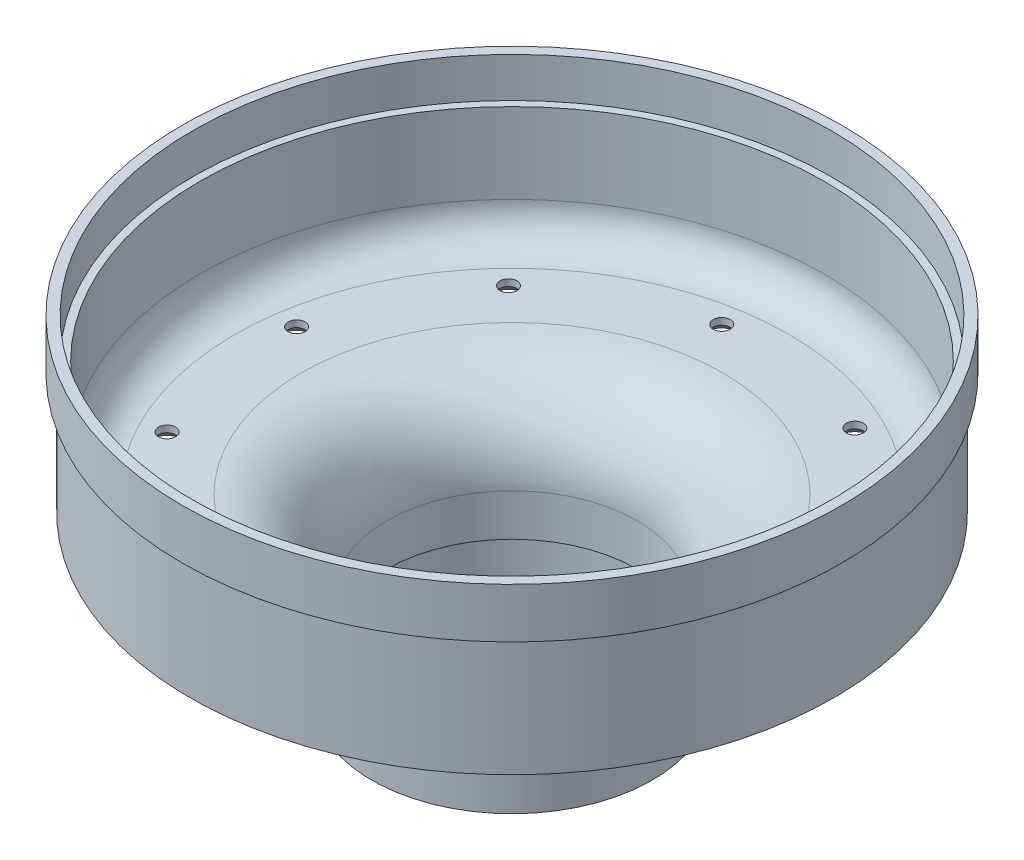
ISO-10303-21;
HEADER;
FILE_DESCRIPTION(('STEP AP214'),'2;1');
FILE_NAME('part.step','',(''),(''),'','','');
FILE_SCHEMA(('AUTOMOTIVE_DESIGN { 1 0 10303 214 1 1 1 1 }'));
ENDSEC;
DATA;
#1=APPLICATION_CONTEXT('core data for automotive mechanical design processes');
#2=APPLICATION_PROTOCOL_DEFINITION('international standard','automotive_design',2000,#1);
#3=PRODUCT_CONTEXT('',#1,'mechanical');
#4=PRODUCT('Part','Part','',(#3));
#5=PRODUCT_RELATED_PRODUCT_CATEGORY('part','',(#4));
#6=PRODUCT_DEFINITION_FORMATION('','',#4);
#7=PRODUCT_DEFINITION_CONTEXT('part definition',#1,'design');
#8=PRODUCT_DEFINITION('design','',#6,#7);
#9=PRODUCT_DEFINITION_SHAPE('','',#8);
#10=(LENGTH_UNIT() NAMED_UNIT(*) SI_UNIT(.MILLI.,.METRE.));
#11=(NAMED_UNIT(*) PLANE_ANGLE_UNIT() SI_UNIT($,.RADIAN.));
#12=(NAMED_UNIT(*) SI_UNIT($,.STERADIAN.) SOLID_ANGLE_UNIT());
#13=UNCERTAINTY_MEASURE_WITH_UNIT(LENGTH_MEASURE(1.E-05),#10,'distance_accuracy_value','');
#14=(GEOMETRIC_REPRESENTATION_CONTEXT(3) GLOBAL_UNCERTAINTY_ASSIGNED_CONTEXT((#13)) GLOBAL_UNIT_ASSIGNED_CONTEXT((#10,
#11,#12)) REPRESENTATION_CONTEXT('',''));
#15=CARTESIAN_POINT('',(0.,0.,0.));
#16=DIRECTION('',(0.,0.,1.));
#17=DIRECTION('',(1.,0.,0.));
#18=AXIS2_PLACEMENT_3D('',#15,#16,#17);
#19=CARTESIAN_POINT('',(-39.98,33.0457479199709,0.));
#20=DIRECTION('',(0.,1.,0.));
#21=DIRECTION('',(0.,0.,1.));
#22=AXIS2_PLACEMENT_3D('',#19,#20,#21);
#23=PLANE('',#22);
#24=CARTESIAN_POINT('',(-22.8065107885822,33.0457479199709,45.8515328604212));
#25=DIRECTION('',(0.,-1.,0.));
#26=DIRECTION('',(0.,0.,-1.));
#27=AXIS2_PLACEMENT_3D('',#24,#25,#26);
#28=CIRCLE('',#27,3.36);
#29=CARTESIAN_POINT('',(-22.8065107885822,33.0457479199709,42.4915328604212));
#30=VERTEX_POINT('',#29);
#31=EDGE_CURVE('E553',#30,#30,#28,.T.);
#32=ORIENTED_EDGE('',*,*,#31,.F.);
#33=EDGE_LOOP('',(#32));
#34=FACE_BOUND('',#33,.T.);
#35=CARTESIAN_POINT('',(-45.4017096207179,33.0457479199709,23.6893386044442));
#36=DIRECTION('',(0.,-1.,0.));
#37=DIRECTION('',(0.,0.,-1.));
#38=AXIS2_PLACEMENT_3D('',#35,#36,#37);
#39=CIRCLE('',#38,3.36);
#40=CARTESIAN_POINT('',(-45.4017096207179,33.0457479199709,20.3293386044442));
#41=VERTEX_POINT('',#40);
#42=EDGE_CURVE('E96',#41,#41,#39,.T.);
#43=ORIENTED_EDGE('',*,*,#42,.F.);
#44=EDGE_LOOP('',(#43));
#45=FACE_BOUND('',#44,.T.);
#46=CARTESIAN_POINT('',(-36.5597996929573,33.0457479199709,-35.8591835714485));
#47=DIRECTION('',(0.,-1.,0.));
#48=DIRECTION('',(0.,0.,-1.));
#49=AXIS2_PLACEMENT_3D('',#46,#47,#48);
#50=CIRCLE('',#49,3.36);
#51=CARTESIAN_POINT('',(-36.5597996929573,33.0457479199709,-39.2191835714485));
#52=VERTEX_POINT('',#51);
#53=EDGE_CURVE('E85',#52,#52,#50,.T.);
#54=ORIENTED_EDGE('',*,*,#53,.F.);
#55=EDGE_LOOP('',(#54));
#56=FACE_BOUND('',#55,.T.);
#57=CARTESIAN_POINT('',(-8.5,33.0457479199709,-50.5));
#58=DIRECTION('',(0.,-1.,0.));
#59=DIRECTION('',(0.,0.,-1.));
#60=AXIS2_PLACEMENT_3D('',#57,#58,#59);
#61=CIRCLE('',#60,3.36);
#62=CARTESIAN_POINT('',(-8.5,33.0457479199709,-53.86));
#63=VERTEX_POINT('',#62);
#64=EDGE_CURVE('E81',#63,#63,#61,.T.);
#65=ORIENTED_EDGE('',*,*,#64,.F.);
#66=EDGE_LOOP('',(#65));
#67=FACE_BOUND('',#66,.T.);
#68=CARTESIAN_POINT('',(22.8065107885826,33.0457479199709,-45.851532860421));
#69=DIRECTION('',(0.,-1.,0.));
#70=DIRECTION('',(0.,0.,-1.));
#71=AXIS2_PLACEMENT_3D('',#68,#69,#70);
#72=CIRCLE('',#71,3.36);
#73=CARTESIAN_POINT('',(22.8065107885826,33.0457479199709,-49.211532860421));
#74=VERTEX_POINT('',#73);
#75=EDGE_CURVE('E76',#74,#74,#72,.T.);
#76=ORIENTED_EDGE('',*,*,#75,.F.);
#77=EDGE_LOOP('',(#76));
#78=FACE_BOUND('',#77,.T.);
#79=CARTESIAN_POINT('',(45.4017096207181,33.0457479199709,-23.6893386044439));
#80=DIRECTION('',(0.,-1.,0.));
#81=DIRECTION('',(0.,0.,-1.));
#82=AXIS2_PLACEMENT_3D('',#79,#80,#81);
#83=CIRCLE('',#82,3.36);
#84=CARTESIAN_POINT('',(45.4017096207181,33.0457479199709,-27.0493386044439));
#85=VERTEX_POINT('',#84);
#86=EDGE_CURVE('E71',#85,#85,#83,.T.);
#87=ORIENTED_EDGE('',*,*,#86,.F.);
#88=EDGE_LOOP('',(#87));
#89=FACE_BOUND('',#88,.T.);
#90=CARTESIAN_POINT('',(50.6549985250923,33.0457479199709,7.5213778274259));
#91=DIRECTION('',(0.,-1.,0.));
#92=DIRECTION('',(0.,0.,-1.));
#93=AXIS2_PLACEMENT_3D('',#90,#91,#92);
#94=CIRCLE('',#93,3.36);
#95=CARTESIAN_POINT('',(50.6549985250923,33.0457479199709,4.1613778274259));
#96=VERTEX_POINT('',#95);
#97=EDGE_CURVE('E66',#96,#96,#94,.T.);
#98=ORIENTED_EDGE('',*,*,#97,.F.);
#99=EDGE_LOOP('',(#98));
#100=FACE_BOUND('',#99,.T.);
#101=CARTESIAN_POINT('',(36.559799692957,33.0457479199709,35.8591835714488));
#102=DIRECTION('',(0.,-1.,0.));
#103=DIRECTION('',(0.,0.,-1.));
#104=AXIS2_PLACEMENT_3D('',#101,#102,#103);
#105=CIRCLE('',#104,3.36);
#106=CARTESIAN_POINT('',(36.559799692957,33.0457479199709,32.4991835714488));
#107=VERTEX_POINT('',#106);
#108=EDGE_CURVE('E61',#107,#107,#105,.T.);
#109=ORIENTED_EDGE('',*,*,#108,.F.);
#110=EDGE_LOOP('',(#109));
#111=FACE_BOUND('',#110,.T.);
#112=CARTESIAN_POINT('',(8.5,33.0457479199709,50.5));
#113=DIRECTION('',(0.,-1.,0.));
#114=DIRECTION('',(0.,0.,-1.));
#115=AXIS2_PLACEMENT_3D('',#112,#113,#114);
#116=CIRCLE('',#115,3.36);
#117=CARTESIAN_POINT('',(8.5,33.0457479199709,47.14));
#118=VERTEX_POINT('',#117);
#119=EDGE_CURVE('E56',#118,#118,#116,.T.);
#120=ORIENTED_EDGE('',*,*,#119,.F.);
#121=EDGE_LOOP('',(#120));
#122=FACE_BOUND('',#121,.T.);
#123=CARTESIAN_POINT('',(0.,33.0457479199709,0.));
#124=DIRECTION('',(0.,-1.,0.));
#125=DIRECTION('',(0.,0.,-1.));
#126=AXIS2_PLACEMENT_3D('',#123,#124,#125);
#127=CIRCLE('',#126,39.98);
#128=CARTESIAN_POINT('',(0.,33.0457479199709,-39.98));
#129=VERTEX_POINT('',#128);
#130=EDGE_CURVE('E139',#129,#129,#127,.T.);
#131=ORIENTED_EDGE('',*,*,#130,.F.);
#132=EDGE_LOOP('',(#131));
#133=FACE_BOUND('',#132,.T.);
#134=CARTESIAN_POINT('',(0.,33.0457479199709,0.));
#135=DIRECTION('',(0.,-1.,0.));
#136=DIRECTION('',(0.,0.,-1.));
#137=AXIS2_PLACEMENT_3D('',#134,#135,#136);
#138=CIRCLE('',#137,64.5);
#139=CARTESIAN_POINT('',(0.,33.0457479199709,-64.5));
#140=VERTEX_POINT('',#139);
#141=EDGE_CURVE('E142',#140,#140,#138,.T.);
#142=ORIENTED_EDGE('',*,*,#141,.T.);
#143=EDGE_LOOP('',(#142));
#144=FACE_BOUND('',#143,.T.);
#145=CARTESIAN_POINT('',(-50.6549985250924,33.0457479199709,-7.52137782742555));
#146=DIRECTION('',(0.,-1.,0.));
#147=DIRECTION('',(0.,0.,-1.));
#148=AXIS2_PLACEMENT_3D('',#145,#146,#147);
#149=CIRCLE('',#148,3.36);
#150=CARTESIAN_POINT('',(-50.6549985250924,33.0457479199709,-10.8813778274256));
#151=VERTEX_POINT('',#150);
#152=EDGE_CURVE('E89',#151,#151,#149,.T.);
#153=ORIENTED_EDGE('',*,*,#152,.F.);
#154=EDGE_LOOP('',(#153));
#155=FACE_BOUND('',#154,.T.);
#156=ADVANCED_FACE('F31',(#34,#45,#56,#67,#78,#89,#100,#111,#122,#133,#144,#155),#23,.F.);
#157=CARTESIAN_POINT('',(-26.6,0.545747919970938,0.));
#158=DIRECTION('',(0.,1.,0.));
#159=DIRECTION('',(0.,0.,1.));
#160=AXIS2_PLACEMENT_3D('',#157,#158,#159);
#161=PLANE('',#160);
#162=CARTESIAN_POINT('',(0.,0.545747919970939,0.));
#163=DIRECTION('',(0.,-1.,0.));
#164=DIRECTION('',(0.,0.,-1.));
#165=AXIS2_PLACEMENT_3D('',#162,#163,#164);
#166=CIRCLE('',#165,26.6);
#167=CARTESIAN_POINT('',(0.,0.545747919970939,-26.6));
#168=VERTEX_POINT('',#167);
#169=EDGE_CURVE('E10',#168,#168,#166,.T.);
#170=ORIENTED_EDGE('',*,*,#169,.F.);
#171=EDGE_LOOP('',(#170));
#172=FACE_BOUND('',#171,.T.);
#173=CARTESIAN_POINT('',(0.,0.545747919970938,0.));
#174=DIRECTION('',(0.,-1.,0.));
#175=DIRECTION('',(0.,0.,-1.));
#176=AXIS2_PLACEMENT_3D('',#173,#174,#175);
#177=CIRCLE('',#176,28.1);
#178=CARTESIAN_POINT('',(0.,0.545747919970938,-28.1));
#179=VERTEX_POINT('',#178);
#180=EDGE_CURVE('E51',#179,#179,#177,.T.);
#181=ORIENTED_EDGE('',*,*,#180,.T.);
#182=EDGE_LOOP('',(#181));
#183=FACE_BOUND('',#182,.T.);
#184=ADVANCED_FACE('F33',(#172,#183),#161,.F.);
#185=CARTESIAN_POINT('',(0.,0.,0.));
#186=DIRECTION('',(0.,-1.,0.));
#187=DIRECTION('',(0.,0.,-1.));
#188=AXIS2_PLACEMENT_3D('',#185,#186,#187);
#189=CYLINDRICAL_SURFACE('',#188,26.6);
#190=CARTESIAN_POINT('',(0.,10.5457479199709,0.));
#191=DIRECTION('',(0.,-1.,0.));
#192=DIRECTION('',(0.,0.,-1.));
#193=AXIS2_PLACEMENT_3D('',#190,#191,#192);
#194=CIRCLE('',#193,26.6);
#195=CARTESIAN_POINT('',(0.,10.5457479199709,-26.6));
#196=VERTEX_POINT('',#195);
#197=EDGE_CURVE('E39',#196,#196,#194,.T.);
#198=ORIENTED_EDGE('',*,*,#197,.F.);
#199=EDGE_LOOP('',(#198));
#200=FACE_BOUND('',#199,.T.);
#201=ORIENTED_EDGE('',*,*,#169,.T.);
#202=EDGE_LOOP('',(#201));
#203=FACE_BOUND('',#202,.T.);
#204=ADVANCED_FACE('F182',(#200,#203),#189,.F.);
#205=CARTESIAN_POINT('',(-26.6,10.5457479199709,0.));
#206=DIRECTION('',(0.,1.,0.));
#207=DIRECTION('',(0.,0.,1.));
#208=AXIS2_PLACEMENT_3D('',#205,#206,#207);
#209=PLANE('',#208);
#210=CARTESIAN_POINT('',(0.,10.5457479199709,0.));
#211=DIRECTION('',(0.,-1.,0.));
#212=DIRECTION('',(0.,0.,-1.));
#213=AXIS2_PLACEMENT_3D('',#210,#211,#212);
#214=CIRCLE('',#213,25.1);
#215=CARTESIAN_POINT('',(0.,10.5457479199709,-25.1));
#216=VERTEX_POINT('',#215);
#217=EDGE_CURVE('E44',#216,#216,#214,.T.);
#218=ORIENTED_EDGE('',*,*,#217,.F.);
#219=EDGE_LOOP('',(#218));
#220=FACE_BOUND('',#219,.T.);
#221=ORIENTED_EDGE('',*,*,#197,.T.);
#222=EDGE_LOOP('',(#221));
#223=FACE_BOUND('',#222,.T.);
#224=ADVANCED_FACE('F179',(#220,#223),#209,.F.);
#225=CARTESIAN_POINT('',(0.,0.,0.));
#226=DIRECTION('',(0.,-1.,0.));
#227=DIRECTION('',(0.,0.,-1.));
#228=AXIS2_PLACEMENT_3D('',#225,#226,#227);
#229=CYLINDRICAL_SURFACE('',#228,25.1);
#230=CARTESIAN_POINT('',(0.,18.9457479199708,0.));
#231=DIRECTION('',(0.,-1.,0.));
#232=DIRECTION('',(0.,0.,-1.));
#233=AXIS2_PLACEMENT_3D('',#230,#231,#232);
#234=CIRCLE('',#233,25.1);
#235=CARTESIAN_POINT('',(0.,18.9457479199708,-25.1));
#236=VERTEX_POINT('',#235);
#237=EDGE_CURVE('E172',#236,#236,#234,.T.);
#238=ORIENTED_EDGE('',*,*,#237,.F.);
#239=EDGE_LOOP('',(#238));
#240=FACE_BOUND('',#239,.T.);
#241=ORIENTED_EDGE('',*,*,#217,.T.);
#242=EDGE_LOOP('',(#241));
#243=FACE_BOUND('',#242,.T.);
#244=ADVANCED_FACE('F177',(#240,#243),#229,.F.);
#245=CARTESIAN_POINT('',(0.,18.9457479199709,0.));
#246=DIRECTION('',(0.,-1.,0.));
#247=DIRECTION('',(0.,0.,-1.));
#248=AXIS2_PLACEMENT_3D('',#245,#246,#247);
#249=TOROIDAL_SURFACE('',#248,42.2,17.1);
#250=CARTESIAN_POINT('',(0.,36.0457479199709,0.));
#251=DIRECTION('',(0.,-1.,0.));
#252=DIRECTION('',(0.,0.,-1.));
#253=AXIS2_PLACEMENT_3D('',#250,#251,#252);
#254=CIRCLE('',#253,42.2000000000001);
#255=CARTESIAN_POINT('',(0.,36.0457479199709,-42.2000000000001));
#256=VERTEX_POINT('',#255);
#257=EDGE_CURVE('E169',#256,#256,#254,.T.);
#258=ORIENTED_EDGE('',*,*,#257,.F.);
#259=EDGE_LOOP('',(#258));
#260=FACE_BOUND('',#259,.T.);
#261=ORIENTED_EDGE('',*,*,#237,.T.);
#262=EDGE_LOOP('',(#261));
#263=FACE_BOUND('',#262,.T.);
#264=ADVANCED_FACE('F237',(#260,#263),#249,.T.);
#265=CARTESIAN_POINT('',(-42.2000000000001,36.0457479199709,0.));
#266=DIRECTION('',(0.,-1.,0.));
#267=DIRECTION('',(0.,0.,-1.));
#268=AXIS2_PLACEMENT_3D('',#265,#266,#267);
#269=PLANE('',#268);
#270=CARTESIAN_POINT('',(-22.8065107885822,36.0457479199709,45.8515328604212));
#271=DIRECTION('',(0.,-1.,0.));
#272=DIRECTION('',(0.,0.,-1.));
#273=AXIS2_PLACEMENT_3D('',#270,#271,#272);
#274=CIRCLE('',#273,1.69999999999999);
#275=CARTESIAN_POINT('',(-22.8065107885822,36.0457479199709,44.1515328604212));
#276=VERTEX_POINT('',#275);
#277=EDGE_CURVE('E35',#276,#276,#274,.T.);
#278=ORIENTED_EDGE('',*,*,#277,.T.);
#279=EDGE_LOOP('',(#278));
#280=FACE_BOUND('',#279,.T.);
#281=CARTESIAN_POINT('',(-45.4017096207179,36.0457479199709,23.6893386044442));
#282=DIRECTION('',(0.,-1.,0.));
#283=DIRECTION('',(0.,0.,-1.));
#284=AXIS2_PLACEMENT_3D('',#281,#282,#283);
#285=CIRCLE('',#284,1.69999999999999);
#286=CARTESIAN_POINT('',(-45.4017096207179,36.0457479199709,21.9893386044442));
#287=VERTEX_POINT('',#286);
#288=EDGE_CURVE('E87',#287,#287,#285,.T.);
#289=ORIENTED_EDGE('',*,*,#288,.T.);
#290=EDGE_LOOP('',(#289));
#291=FACE_BOUND('',#290,.T.);
#292=CARTESIAN_POINT('',(-50.6549985250924,36.0457479199709,-7.52137782742555));
#293=DIRECTION('',(0.,-1.,0.));
#294=DIRECTION('',(0.,0.,-1.));
#295=AXIS2_PLACEMENT_3D('',#292,#293,#294);
#296=CIRCLE('',#295,1.69999999999999);
#297=CARTESIAN_POINT('',(-50.6549985250924,36.0457479199709,-9.22137782742555));
#298=VERTEX_POINT('',#297);
#299=EDGE_CURVE('E83',#298,#298,#296,.T.);
#300=ORIENTED_EDGE('',*,*,#299,.T.);
#301=EDGE_LOOP('',(#300));
#302=FACE_BOUND('',#301,.T.);
#303=CARTESIAN_POINT('',(-36.5597996929573,36.0457479199709,-35.8591835714485));
#304=DIRECTION('',(0.,-1.,0.));
#305=DIRECTION('',(0.,0.,-1.));
#306=AXIS2_PLACEMENT_3D('',#303,#304,#305);
#307=CIRCLE('',#306,1.69999999999999);
#308=CARTESIAN_POINT('',(-36.5597996929573,36.0457479199709,-37.5591835714485));
#309=VERTEX_POINT('',#308);
#310=EDGE_CURVE('E78',#309,#309,#307,.T.);
#311=ORIENTED_EDGE('',*,*,#310,.T.);
#312=EDGE_LOOP('',(#311));
#313=FACE_BOUND('',#312,.T.);
#314=CARTESIAN_POINT('',(-8.5,36.0457479199709,-50.5));
#315=DIRECTION('',(0.,-1.,0.));
#316=DIRECTION('',(0.,0.,-1.));
#317=AXIS2_PLACEMENT_3D('',#314,#315,#316);
#318=CIRCLE('',#317,1.69999999999999);
#319=CARTESIAN_POINT('',(-8.5,36.0457479199709,-52.2));
#320=VERTEX_POINT('',#319);
#321=EDGE_CURVE('E73',#320,#320,#318,.T.);
#322=ORIENTED_EDGE('',*,*,#321,.T.);
#323=EDGE_LOOP('',(#322));
#324=FACE_BOUND('',#323,.T.);
#325=CARTESIAN_POINT('',(22.8065107885826,36.0457479199709,-45.851532860421));
#326=DIRECTION('',(0.,-1.,0.));
#327=DIRECTION('',(0.,0.,-1.));
#328=AXIS2_PLACEMENT_3D('',#325,#326,#327);
#329=CIRCLE('',#328,1.69999999999999);
#330=CARTESIAN_POINT('',(22.8065107885826,36.0457479199709,-47.551532860421));
#331=VERTEX_POINT('',#330);
#332=EDGE_CURVE('E68',#331,#331,#329,.T.);
#333=ORIENTED_EDGE('',*,*,#332,.T.);
#334=EDGE_LOOP('',(#333));
#335=FACE_BOUND('',#334,.T.);
#336=CARTESIAN_POINT('',(45.4017096207181,36.0457479199709,-23.6893386044439));
#337=DIRECTION('',(0.,-1.,0.));
#338=DIRECTION('',(0.,0.,-1.));
#339=AXIS2_PLACEMENT_3D('',#336,#337,#338);
#340=CIRCLE('',#339,1.69999999999999);
#341=CARTESIAN_POINT('',(45.4017096207181,36.0457479199709,-25.3893386044438));
#342=VERTEX_POINT('',#341);
#343=EDGE_CURVE('E63',#342,#342,#340,.T.);
#344=ORIENTED_EDGE('',*,*,#343,.T.);
#345=EDGE_LOOP('',(#344));
#346=FACE_BOUND('',#345,.T.);
#347=CARTESIAN_POINT('',(50.6549985250923,36.0457479199709,7.5213778274259));
#348=DIRECTION('',(0.,-1.,0.));
#349=DIRECTION('',(0.,0.,-1.));
#350=AXIS2_PLACEMENT_3D('',#347,#348,#349);
#351=CIRCLE('',#350,1.69999999999999);
#352=CARTESIAN_POINT('',(50.6549985250923,36.0457479199709,5.8213778274259));
#353=VERTEX_POINT('',#352);
#354=EDGE_CURVE('E58',#353,#353,#351,.T.);
#355=ORIENTED_EDGE('',*,*,#354,.T.);
#356=EDGE_LOOP('',(#355));
#357=FACE_BOUND('',#356,.T.);
#358=CARTESIAN_POINT('',(36.559799692957,36.0457479199709,35.8591835714488));
#359=DIRECTION('',(0.,-1.,0.));
#360=DIRECTION('',(0.,0.,-1.));
#361=AXIS2_PLACEMENT_3D('',#358,#359,#360);
#362=CIRCLE('',#361,1.69999999999999);
#363=CARTESIAN_POINT('',(36.559799692957,36.0457479199709,34.1591835714488));
#364=VERTEX_POINT('',#363);
#365=EDGE_CURVE('E53',#364,#364,#362,.T.);
#366=ORIENTED_EDGE('',*,*,#365,.T.);
#367=EDGE_LOOP('',(#366));
#368=FACE_BOUND('',#367,.T.);
#369=CARTESIAN_POINT('',(8.5,36.0457479199709,50.5));
#370=DIRECTION('',(0.,-1.,0.));
#371=DIRECTION('',(0.,0.,-1.));
#372=AXIS2_PLACEMENT_3D('',#369,#370,#371);
#373=CIRCLE('',#372,1.69999999999999);
#374=CARTESIAN_POINT('',(8.5,36.0457479199709,48.8));
#375=VERTEX_POINT('',#374);
#376=EDGE_CURVE('E48',#375,#375,#373,.T.);
#377=ORIENTED_EDGE('',*,*,#376,.T.);
#378=EDGE_LOOP('',(#377));
#379=FACE_BOUND('',#378,.T.);
#380=CARTESIAN_POINT('',(0.,36.0457479199709,0.));
#381=DIRECTION('',(0.,-1.,0.));
#382=DIRECTION('',(0.,0.,-1.));
#383=AXIS2_PLACEMENT_3D('',#380,#381,#382);
#384=CIRCLE('',#383,55.5);
#385=CARTESIAN_POINT('',(0.,36.0457479199709,-55.5));
#386=VERTEX_POINT('',#385);
#387=EDGE_CURVE('E166',#386,#386,#384,.T.);
#388=ORIENTED_EDGE('',*,*,#387,.F.);
#389=EDGE_LOOP('',(#388));
#390=FACE_BOUND('',#389,.T.);
#391=ORIENTED_EDGE('',*,*,#257,.T.);
#392=EDGE_LOOP('',(#391));
#393=FACE_BOUND('',#392,.T.);
#394=ADVANCED_FACE('F233',(#280,#291,#302,#313,#324,#335,#346,#357,#368,#379,#390,#393),#269,.F.);
#395=CARTESIAN_POINT('',(0.,43.0457479199709,0.));
#396=DIRECTION('',(0.,-1.,0.));
#397=DIRECTION('',(0.,0.,-1.));
#398=AXIS2_PLACEMENT_3D('',#395,#396,#397);
#399=TOROIDAL_SURFACE('',#398,55.5,7.);
#400=CARTESIAN_POINT('',(0.,43.0457479199709,0.));
#401=DIRECTION('',(0.,-1.,0.));
#402=DIRECTION('',(0.,0.,-1.));
#403=AXIS2_PLACEMENT_3D('',#400,#401,#402);
#404=CIRCLE('',#403,62.5);
#405=CARTESIAN_POINT('',(0.,43.0457479199709,-62.5));
#406=VERTEX_POINT('',#405);
#407=EDGE_CURVE('E163',#406,#406,#404,.T.);
#408=ORIENTED_EDGE('',*,*,#407,.F.);
#409=EDGE_LOOP('',(#408));
#410=FACE_BOUND('',#409,.T.);
#411=ORIENTED_EDGE('',*,*,#387,.T.);
#412=EDGE_LOOP('',(#411));
#413=FACE_BOUND('',#412,.T.);
#414=ADVANCED_FACE('F229',(#410,#413),#399,.F.);
#415=CARTESIAN_POINT('',(0.,0.,0.));
#416=DIRECTION('',(0.,-1.,0.));
#417=DIRECTION('',(0.,0.,-1.));
#418=AXIS2_PLACEMENT_3D('',#415,#416,#417);
#419=CYLINDRICAL_SURFACE('',#418,62.5);
#420=CARTESIAN_POINT('',(0.,59.1293323961174,0.));
#421=DIRECTION('',(0.,-1.,0.));
#422=DIRECTION('',(0.,0.,-1.));
#423=AXIS2_PLACEMENT_3D('',#420,#421,#422);
#424=CIRCLE('',#423,62.5);
#425=CARTESIAN_POINT('',(0.,59.1293323961174,-62.5));
#426=VERTEX_POINT('',#425);
#427=EDGE_CURVE('E160',#426,#426,#424,.T.);
#428=ORIENTED_EDGE('',*,*,#427,.F.);
#429=EDGE_LOOP('',(#428));
#430=FACE_BOUND('',#429,.T.);
#431=ORIENTED_EDGE('',*,*,#407,.T.);
#432=EDGE_LOOP('',(#431));
#433=FACE_BOUND('',#432,.T.);
#434=ADVANCED_FACE('F225',(#430,#433),#419,.F.);
#435=CARTESIAN_POINT('',(-62.5,59.1293323961174,0.));
#436=DIRECTION('',(0.,-1.,0.));
#437=DIRECTION('',(0.,0.,-1.));
#438=AXIS2_PLACEMENT_3D('',#435,#436,#437);
#439=PLANE('',#438);
#440=CARTESIAN_POINT('',(0.,59.1293323961174,0.));
#441=DIRECTION('',(0.,-1.,0.));
#442=DIRECTION('',(0.,0.,-1.));
#443=AXIS2_PLACEMENT_3D('',#440,#441,#442);
#444=CIRCLE('',#443,64.);
#445=CARTESIAN_POINT('',(0.,59.1293323961174,-64.));
#446=VERTEX_POINT('',#445);
#447=EDGE_CURVE('E157',#446,#446,#444,.T.);
#448=ORIENTED_EDGE('',*,*,#447,.F.);
#449=EDGE_LOOP('',(#448));
#450=FACE_BOUND('',#449,.T.);
#451=ORIENTED_EDGE('',*,*,#427,.T.);
#452=EDGE_LOOP('',(#451));
#453=FACE_BOUND('',#452,.T.);
#454=ADVANCED_FACE('F221',(#450,#453),#439,.F.);
#455=CARTESIAN_POINT('',(0.,0.,0.));
#456=DIRECTION('',(0.,-1.,0.));
#457=DIRECTION('',(0.,0.,-1.));
#458=AXIS2_PLACEMENT_3D('',#455,#456,#457);
#459=CYLINDRICAL_SURFACE('',#458,64.);
#460=CARTESIAN_POINT('',(0.,67.1293323961174,0.));
#461=DIRECTION('',(0.,-1.,0.));
#462=DIRECTION('',(0.,0.,-1.));
#463=AXIS2_PLACEMENT_3D('',#460,#461,#462);
#464=CIRCLE('',#463,64.);
#465=CARTESIAN_POINT('',(0.,67.1293323961174,-64.));
#466=VERTEX_POINT('',#465);
#467=EDGE_CURVE('E154',#466,#466,#464,.T.);
#468=ORIENTED_EDGE('',*,*,#467,.F.);
#469=EDGE_LOOP('',(#468));
#470=FACE_BOUND('',#469,.T.);
#471=ORIENTED_EDGE('',*,*,#447,.T.);
#472=EDGE_LOOP('',(#471));
#473=FACE_BOUND('',#472,.T.);
#474=ADVANCED_FACE('F217',(#470,#473),#459,.F.);
#475=CARTESIAN_POINT('',(-66.,67.1293323961174,0.));
#476=DIRECTION('',(0.,-1.,0.));
#477=DIRECTION('',(0.,0.,-1.));
#478=AXIS2_PLACEMENT_3D('',#475,#476,#477);
#479=PLANE('',#478);
#480=CARTESIAN_POINT('',(0.,67.1293323961174,0.));
#481=DIRECTION('',(0.,-1.,0.));
#482=DIRECTION('',(0.,0.,-1.));
#483=AXIS2_PLACEMENT_3D('',#480,#481,#482);
#484=CIRCLE('',#483,66.);
#485=CARTESIAN_POINT('',(0.,67.1293323961174,-66.));
#486=VERTEX_POINT('',#485);
#487=EDGE_CURVE('E151',#486,#486,#484,.T.);
#488=ORIENTED_EDGE('',*,*,#487,.F.);
#489=EDGE_LOOP('',(#488));
#490=FACE_BOUND('',#489,.T.);
#491=ORIENTED_EDGE('',*,*,#467,.T.);
#492=EDGE_LOOP('',(#491));
#493=FACE_BOUND('',#492,.T.);
#494=ADVANCED_FACE('F213',(#490,#493),#479,.F.);
#495=CARTESIAN_POINT('',(0.,0.,0.));
#496=DIRECTION('',(0.,-1.,0.));
#497=DIRECTION('',(0.,0.,-1.));
#498=AXIS2_PLACEMENT_3D('',#495,#496,#497);
#499=CYLINDRICAL_SURFACE('',#498,66.);
#500=CARTESIAN_POINT('',(0.,57.1293323961174,0.));
#501=DIRECTION('',(0.,-1.,0.));
#502=DIRECTION('',(0.,0.,-1.));
#503=AXIS2_PLACEMENT_3D('',#500,#501,#502);
#504=CIRCLE('',#503,66.);
#505=CARTESIAN_POINT('',(0.,57.1293323961174,-66.));
#506=VERTEX_POINT('',#505);
#507=EDGE_CURVE('E148',#506,#506,#504,.T.);
#508=ORIENTED_EDGE('',*,*,#507,.F.);
#509=EDGE_LOOP('',(#508));
#510=FACE_BOUND('',#509,.T.);
#511=ORIENTED_EDGE('',*,*,#487,.T.);
#512=EDGE_LOOP('',(#511));
#513=FACE_BOUND('',#512,.T.);
#514=ADVANCED_FACE('F209',(#510,#513),#499,.T.);
#515=CARTESIAN_POINT('',(-64.5,57.1293323961174,0.));
#516=DIRECTION('',(0.,1.,0.));
#517=DIRECTION('',(0.,0.,1.));
#518=AXIS2_PLACEMENT_3D('',#515,#516,#517);
#519=PLANE('',#518);
#520=CARTESIAN_POINT('',(0.,57.1293323961174,0.));
#521=DIRECTION('',(0.,-1.,0.));
#522=DIRECTION('',(0.,0.,-1.));
#523=AXIS2_PLACEMENT_3D('',#520,#521,#522);
#524=CIRCLE('',#523,64.5);
#525=CARTESIAN_POINT('',(0.,57.1293323961174,-64.5));
#526=VERTEX_POINT('',#525);
#527=EDGE_CURVE('E145',#526,#526,#524,.T.);
#528=ORIENTED_EDGE('',*,*,#527,.F.);
#529=EDGE_LOOP('',(#528));
#530=FACE_BOUND('',#529,.T.);
#531=ORIENTED_EDGE('',*,*,#507,.T.);
#532=EDGE_LOOP('',(#531));
#533=FACE_BOUND('',#532,.T.);
#534=ADVANCED_FACE('F205',(#530,#533),#519,.F.);
#535=CARTESIAN_POINT('',(0.,0.,0.));
#536=DIRECTION('',(0.,-1.,0.));
#537=DIRECTION('',(0.,0.,-1.));
#538=AXIS2_PLACEMENT_3D('',#535,#536,#537);
#539=CYLINDRICAL_SURFACE('',#538,64.5);
#540=ORIENTED_EDGE('',*,*,#141,.F.);
#541=EDGE_LOOP('',(#540));
#542=FACE_BOUND('',#541,.T.);
#543=ORIENTED_EDGE('',*,*,#527,.T.);
#544=EDGE_LOOP('',(#543));
#545=FACE_BOUND('',#544,.T.);
#546=ADVANCED_FACE('F202',(#542,#545),#539,.T.);
#547=CARTESIAN_POINT('',(0.,21.1657479199709,0.));
#548=DIRECTION('',(0.,-1.,0.));
#549=DIRECTION('',(0.,0.,-1.));
#550=AXIS2_PLACEMENT_3D('',#547,#548,#549);
#551=TOROIDAL_SURFACE('',#550,39.98,11.88);
#552=CARTESIAN_POINT('',(0.,21.1657479199709,0.));
#553=DIRECTION('',(0.,-1.,0.));
#554=DIRECTION('',(0.,0.,-1.));
#555=AXIS2_PLACEMENT_3D('',#552,#553,#554);
#556=CIRCLE('',#555,28.1);
#557=CARTESIAN_POINT('',(0.,21.1657479199709,-28.1));
#558=VERTEX_POINT('',#557);
#559=EDGE_CURVE('E136',#558,#558,#556,.T.);
#560=ORIENTED_EDGE('',*,*,#559,.F.);
#561=EDGE_LOOP('',(#560));
#562=FACE_BOUND('',#561,.T.);
#563=ORIENTED_EDGE('',*,*,#130,.T.);
#564=EDGE_LOOP('',(#563));
#565=FACE_BOUND('',#564,.T.);
#566=ADVANCED_FACE('F200',(#562,#565),#551,.F.);
#567=CARTESIAN_POINT('',(0.,0.,0.));
#568=DIRECTION('',(0.,-1.,0.));
#569=DIRECTION('',(0.,0.,-1.));
#570=AXIS2_PLACEMENT_3D('',#567,#568,#569);
#571=CYLINDRICAL_SURFACE('',#570,28.1);
#572=ORIENTED_EDGE('',*,*,#180,.F.);
#573=EDGE_LOOP('',(#572));
#574=FACE_BOUND('',#573,.T.);
#575=ORIENTED_EDGE('',*,*,#559,.T.);
#576=EDGE_LOOP('',(#575));
#577=FACE_BOUND('',#576,.T.);
#578=ADVANCED_FACE('F297',(#574,#577),#571,.T.);
#579=CARTESIAN_POINT('',(8.5,33.0457479199709,50.5));
#580=DIRECTION('',(0.,-1.,0.));
#581=DIRECTION('',(0.,0.,-1.));
#582=AXIS2_PLACEMENT_3D('',#579,#580,#581);
#583=CYLINDRICAL_SURFACE('',#582,1.69999999999999);
#584=CARTESIAN_POINT('',(8.5,34.7057479199709,50.5));
#585=DIRECTION('',(0.,-1.,0.));
#586=DIRECTION('',(0.,0.,-1.));
#587=AXIS2_PLACEMENT_3D('',#584,#585,#586);
#588=CIRCLE('',#587,1.69999999999999);
#589=CARTESIAN_POINT('',(8.5,34.7057479199709,48.8));
#590=VERTEX_POINT('',#589);
#591=EDGE_CURVE('E52',#590,#590,#588,.T.);
#592=ORIENTED_EDGE('',*,*,#591,.T.);
#593=EDGE_LOOP('',(#592));
#594=FACE_BOUND('',#593,.T.);
#595=ORIENTED_EDGE('',*,*,#376,.F.);
#596=EDGE_LOOP('',(#595));
#597=FACE_BOUND('',#596,.T.);
#598=ADVANCED_FACE('F304',(#594,#597),#583,.F.);
#599=CARTESIAN_POINT('',(8.5,33.0457479199709,50.5));
#600=DIRECTION('',(0.,-1.,0.));
#601=DIRECTION('',(0.,0.,-1.));
#602=AXIS2_PLACEMENT_3D('',#599,#600,#601);
#603=CONICAL_SURFACE('',#602,3.36,0.785398163397445);
#604=ORIENTED_EDGE('',*,*,#591,.F.);
#605=EDGE_LOOP('',(#604));
#606=FACE_BOUND('',#605,.T.);
#607=ORIENTED_EDGE('',*,*,#119,.T.);
#608=EDGE_LOOP('',(#607));
#609=FACE_BOUND('',#608,.T.);
#610=ADVANCED_FACE('F311',(#606,#609),#603,.F.);
#611=CARTESIAN_POINT('',(36.559799692957,33.0457479199709,35.8591835714488));
#612=DIRECTION('',(0.,-1.,0.));
#613=DIRECTION('',(0.,0.,-1.));
#614=AXIS2_PLACEMENT_3D('',#611,#612,#613);
#615=CYLINDRICAL_SURFACE('',#614,1.69999999999999);
#616=CARTESIAN_POINT('',(36.559799692957,34.7057479199709,35.8591835714488));
#617=DIRECTION('',(0.,-1.,0.));
#618=DIRECTION('',(0.,0.,-1.));
#619=AXIS2_PLACEMENT_3D('',#616,#617,#618);
#620=CIRCLE('',#619,1.69999999999999);
#621=CARTESIAN_POINT('',(36.559799692957,34.7057479199709,34.1591835714488));
#622=VERTEX_POINT('',#621);
#623=EDGE_CURVE('E57',#622,#622,#620,.T.);
#624=ORIENTED_EDGE('',*,*,#623,.T.);
#625=EDGE_LOOP('',(#624));
#626=FACE_BOUND('',#625,.T.);
#627=ORIENTED_EDGE('',*,*,#365,.F.);
#628=EDGE_LOOP('',(#627));
#629=FACE_BOUND('',#628,.T.);
#630=ADVANCED_FACE('F319',(#626,#629),#615,.F.);
#631=CARTESIAN_POINT('',(36.559799692957,33.0457479199709,35.8591835714488));
#632=DIRECTION('',(0.,-1.,0.));
#633=DIRECTION('',(0.,0.,-1.));
#634=AXIS2_PLACEMENT_3D('',#631,#632,#633);
#635=CONICAL_SURFACE('',#634,3.36,0.785398163397446);
#636=ORIENTED_EDGE('',*,*,#623,.F.);
#637=EDGE_LOOP('',(#636));
#638=FACE_BOUND('',#637,.T.);
#639=ORIENTED_EDGE('',*,*,#108,.T.);
#640=EDGE_LOOP('',(#639));
#641=FACE_BOUND('',#640,.T.);
#642=ADVANCED_FACE('F326',(#638,#641),#635,.F.);
#643=CARTESIAN_POINT('',(50.6549985250923,33.0457479199709,7.5213778274259));
#644=DIRECTION('',(0.,-1.,0.));
#645=DIRECTION('',(0.,0.,-1.));
#646=AXIS2_PLACEMENT_3D('',#643,#644,#645);
#647=CYLINDRICAL_SURFACE('',#646,1.69999999999999);
#648=CARTESIAN_POINT('',(50.6549985250923,34.7057479199709,7.5213778274259));
#649=DIRECTION('',(0.,-1.,0.));
#650=DIRECTION('',(0.,0.,-1.));
#651=AXIS2_PLACEMENT_3D('',#648,#649,#650);
#652=CIRCLE('',#651,1.69999999999999);
#653=CARTESIAN_POINT('',(50.6549985250923,34.7057479199709,5.82137782742591));
#654=VERTEX_POINT('',#653);
#655=EDGE_CURVE('E62',#654,#654,#652,.T.);
#656=ORIENTED_EDGE('',*,*,#655,.T.);
#657=EDGE_LOOP('',(#656));
#658=FACE_BOUND('',#657,.T.);
#659=ORIENTED_EDGE('',*,*,#354,.F.);
#660=EDGE_LOOP('',(#659));
#661=FACE_BOUND('',#660,.T.);
#662=ADVANCED_FACE('F334',(#658,#661),#647,.F.);
#663=CARTESIAN_POINT('',(50.6549985250923,33.0457479199709,7.5213778274259));
#664=DIRECTION('',(0.,-1.,0.));
#665=DIRECTION('',(0.,0.,-1.));
#666=AXIS2_PLACEMENT_3D('',#663,#664,#665);
#667=CONICAL_SURFACE('',#666,3.36,0.785398163397446);
#668=ORIENTED_EDGE('',*,*,#655,.F.);
#669=EDGE_LOOP('',(#668));
#670=FACE_BOUND('',#669,.T.);
#671=ORIENTED_EDGE('',*,*,#97,.T.);
#672=EDGE_LOOP('',(#671));
#673=FACE_BOUND('',#672,.T.);
#674=ADVANCED_FACE('F342',(#670,#673),#667,.F.);
#675=CARTESIAN_POINT('',(45.4017096207181,33.0457479199709,-23.6893386044439));
#676=DIRECTION('',(0.,-1.,0.));
#677=DIRECTION('',(0.,0.,-1.));
#678=AXIS2_PLACEMENT_3D('',#675,#676,#677);
#679=CYLINDRICAL_SURFACE('',#678,1.69999999999999);
#680=CARTESIAN_POINT('',(45.4017096207181,34.7057479199709,-23.6893386044439));
#681=DIRECTION('',(0.,-1.,0.));
#682=DIRECTION('',(0.,0.,-1.));
#683=AXIS2_PLACEMENT_3D('',#680,#681,#682);
#684=CIRCLE('',#683,1.69999999999999);
#685=CARTESIAN_POINT('',(45.4017096207181,34.7057479199709,-25.3893386044438));
#686=VERTEX_POINT('',#685);
#687=EDGE_CURVE('E67',#686,#686,#684,.T.);
#688=ORIENTED_EDGE('',*,*,#687,.T.);
#689=EDGE_LOOP('',(#688));
#690=FACE_BOUND('',#689,.T.);
#691=ORIENTED_EDGE('',*,*,#343,.F.);
#692=EDGE_LOOP('',(#691));
#693=FACE_BOUND('',#692,.T.);
#694=ADVANCED_FACE('F350',(#690,#693),#679,.F.);
#695=CARTESIAN_POINT('',(45.4017096207181,33.0457479199709,-23.6893386044439));
#696=DIRECTION('',(0.,-1.,0.));
#697=DIRECTION('',(0.,0.,-1.));
#698=AXIS2_PLACEMENT_3D('',#695,#696,#697);
#699=CONICAL_SURFACE('',#698,3.36,0.785398163397446);
#700=ORIENTED_EDGE('',*,*,#687,.F.);
#701=EDGE_LOOP('',(#700));
#702=FACE_BOUND('',#701,.T.);
#703=ORIENTED_EDGE('',*,*,#86,.T.);
#704=EDGE_LOOP('',(#703));
#705=FACE_BOUND('',#704,.T.);
#706=ADVANCED_FACE('F358',(#702,#705),#699,.F.);
#707=CARTESIAN_POINT('',(22.8065107885826,33.0457479199709,-45.851532860421));
#708=DIRECTION('',(0.,-1.,0.));
#709=DIRECTION('',(0.,0.,-1.));
#710=AXIS2_PLACEMENT_3D('',#707,#708,#709);
#711=CYLINDRICAL_SURFACE('',#710,1.69999999999999);
#712=CARTESIAN_POINT('',(22.8065107885826,34.7057479199709,-45.851532860421));
#713=DIRECTION('',(0.,-1.,0.));
#714=DIRECTION('',(0.,0.,-1.));
#715=AXIS2_PLACEMENT_3D('',#712,#713,#714);
#716=CIRCLE('',#715,1.69999999999999);
#717=CARTESIAN_POINT('',(22.8065107885826,34.7057479199709,-47.551532860421));
#718=VERTEX_POINT('',#717);
#719=EDGE_CURVE('E72',#718,#718,#716,.T.);
#720=ORIENTED_EDGE('',*,*,#719,.T.);
#721=EDGE_LOOP('',(#720));
#722=FACE_BOUND('',#721,.T.);
#723=ORIENTED_EDGE('',*,*,#332,.F.);
#724=EDGE_LOOP('',(#723));
#725=FACE_BOUND('',#724,.T.);
#726=ADVANCED_FACE('F366',(#722,#725),#711,.F.);
#727=CARTESIAN_POINT('',(22.8065107885826,33.0457479199709,-45.851532860421));
#728=DIRECTION('',(0.,-1.,0.));
#729=DIRECTION('',(0.,0.,-1.));
#730=AXIS2_PLACEMENT_3D('',#727,#728,#729);
#731=CONICAL_SURFACE('',#730,3.36,0.785398163397446);
#732=ORIENTED_EDGE('',*,*,#719,.F.);
#733=EDGE_LOOP('',(#732));
#734=FACE_BOUND('',#733,.T.);
#735=ORIENTED_EDGE('',*,*,#75,.T.);
#736=EDGE_LOOP('',(#735));
#737=FACE_BOUND('',#736,.T.);
#738=ADVANCED_FACE('F374',(#734,#737),#731,.F.);
#739=CARTESIAN_POINT('',(-8.5,33.0457479199709,-50.5));
#740=DIRECTION('',(0.,-1.,0.));
#741=DIRECTION('',(0.,0.,-1.));
#742=AXIS2_PLACEMENT_3D('',#739,#740,#741);
#743=CYLINDRICAL_SURFACE('',#742,1.69999999999999);
#744=CARTESIAN_POINT('',(-8.5,34.7057479199709,-50.5));
#745=DIRECTION('',(0.,-1.,0.));
#746=DIRECTION('',(0.,0.,-1.));
#747=AXIS2_PLACEMENT_3D('',#744,#745,#746);
#748=CIRCLE('',#747,1.69999999999999);
#749=CARTESIAN_POINT('',(-8.5,34.7057479199709,-52.2));
#750=VERTEX_POINT('',#749);
#751=EDGE_CURVE('E77',#750,#750,#748,.T.);
#752=ORIENTED_EDGE('',*,*,#751,.T.);
#753=EDGE_LOOP('',(#752));
#754=FACE_BOUND('',#753,.T.);
#755=ORIENTED_EDGE('',*,*,#321,.F.);
#756=EDGE_LOOP('',(#755));
#757=FACE_BOUND('',#756,.T.);
#758=ADVANCED_FACE('F382',(#754,#757),#743,.F.);
#759=CARTESIAN_POINT('',(-8.5,33.0457479199709,-50.5));
#760=DIRECTION('',(0.,-1.,0.));
#761=DIRECTION('',(0.,0.,-1.));
#762=AXIS2_PLACEMENT_3D('',#759,#760,#761);
#763=CONICAL_SURFACE('',#762,3.36,0.785398163397445);
#764=ORIENTED_EDGE('',*,*,#751,.F.);
#765=EDGE_LOOP('',(#764));
#766=FACE_BOUND('',#765,.T.);
#767=ORIENTED_EDGE('',*,*,#64,.T.);
#768=EDGE_LOOP('',(#767));
#769=FACE_BOUND('',#768,.T.);
#770=ADVANCED_FACE('F390',(#766,#769),#763,.F.);
#771=CARTESIAN_POINT('',(-36.5597996929573,33.0457479199709,-35.8591835714485));
#772=DIRECTION('',(0.,-1.,0.));
#773=DIRECTION('',(0.,0.,-1.));
#774=AXIS2_PLACEMENT_3D('',#771,#772,#773);
#775=CYLINDRICAL_SURFACE('',#774,1.69999999999999);
#776=CARTESIAN_POINT('',(-36.5597996929573,34.7057479199709,-35.8591835714485));
#777=DIRECTION('',(0.,-1.,0.));
#778=DIRECTION('',(0.,0.,-1.));
#779=AXIS2_PLACEMENT_3D('',#776,#777,#778);
#780=CIRCLE('',#779,1.69999999999999);
#781=CARTESIAN_POINT('',(-36.5597996929573,34.7057479199709,-37.5591835714485));
#782=VERTEX_POINT('',#781);
#783=EDGE_CURVE('E82',#782,#782,#780,.T.);
#784=ORIENTED_EDGE('',*,*,#783,.T.);
#785=EDGE_LOOP('',(#784));
#786=FACE_BOUND('',#785,.T.);
#787=ORIENTED_EDGE('',*,*,#310,.F.);
#788=EDGE_LOOP('',(#787));
#789=FACE_BOUND('',#788,.T.);
#790=ADVANCED_FACE('F398',(#786,#789),#775,.F.);
#791=CARTESIAN_POINT('',(-36.5597996929573,33.0457479199709,-35.8591835714485));
#792=DIRECTION('',(0.,-1.,0.));
#793=DIRECTION('',(0.,0.,-1.));
#794=AXIS2_PLACEMENT_3D('',#791,#792,#793);
#795=CONICAL_SURFACE('',#794,3.36,0.785398163397446);
#796=ORIENTED_EDGE('',*,*,#783,.F.);
#797=EDGE_LOOP('',(#796));
#798=FACE_BOUND('',#797,.T.);
#799=ORIENTED_EDGE('',*,*,#53,.T.);
#800=EDGE_LOOP('',(#799));
#801=FACE_BOUND('',#800,.T.);
#802=ADVANCED_FACE('F406',(#798,#801),#795,.F.);
#803=CARTESIAN_POINT('',(-50.6549985250924,33.0457479199709,-7.52137782742555));
#804=DIRECTION('',(0.,-1.,0.));
#805=DIRECTION('',(0.,0.,-1.));
#806=AXIS2_PLACEMENT_3D('',#803,#804,#805);
#807=CYLINDRICAL_SURFACE('',#806,1.69999999999999);
#808=CARTESIAN_POINT('',(-50.6549985250924,34.7057479199709,-7.52137782742555));
#809=DIRECTION('',(0.,-1.,0.));
#810=DIRECTION('',(0.,0.,-1.));
#811=AXIS2_PLACEMENT_3D('',#808,#809,#810);
#812=CIRCLE('',#811,1.69999999999999);
#813=CARTESIAN_POINT('',(-50.6549985250924,34.7057479199709,-9.22137782742554));
#814=VERTEX_POINT('',#813);
#815=EDGE_CURVE('E86',#814,#814,#812,.T.);
#816=ORIENTED_EDGE('',*,*,#815,.T.);
#817=EDGE_LOOP('',(#816));
#818=FACE_BOUND('',#817,.T.);
#819=ORIENTED_EDGE('',*,*,#299,.F.);
#820=EDGE_LOOP('',(#819));
#821=FACE_BOUND('',#820,.T.);
#822=ADVANCED_FACE('F414',(#818,#821),#807,.F.);
#823=CARTESIAN_POINT('',(-50.6549985250924,33.0457479199709,-7.52137782742555));
#824=DIRECTION('',(0.,-1.,0.));
#825=DIRECTION('',(0.,0.,-1.));
#826=AXIS2_PLACEMENT_3D('',#823,#824,#825);
#827=CONICAL_SURFACE('',#826,3.36,0.785398163397446);
#828=ORIENTED_EDGE('',*,*,#815,.F.);
#829=EDGE_LOOP('',(#828));
#830=FACE_BOUND('',#829,.T.);
#831=ORIENTED_EDGE('',*,*,#152,.T.);
#832=EDGE_LOOP('',(#831));
#833=FACE_BOUND('',#832,.T.);
#834=ADVANCED_FACE('F422',(#830,#833),#827,.F.);
#835=CARTESIAN_POINT('',(-45.4017096207179,33.0457479199709,23.6893386044442));
#836=DIRECTION('',(0.,-1.,0.));
#837=DIRECTION('',(0.,0.,-1.));
#838=AXIS2_PLACEMENT_3D('',#835,#836,#837);
#839=CYLINDRICAL_SURFACE('',#838,1.69999999999999);
#840=CARTESIAN_POINT('',(-45.4017096207179,34.7057479199709,23.6893386044442));
#841=DIRECTION('',(0.,-1.,0.));
#842=DIRECTION('',(0.,0.,-1.));
#843=AXIS2_PLACEMENT_3D('',#840,#841,#842);
#844=CIRCLE('',#843,1.69999999999999);
#845=CARTESIAN_POINT('',(-45.4017096207179,34.7057479199709,21.9893386044442));
#846=VERTEX_POINT('',#845);
#847=EDGE_CURVE('E90',#846,#846,#844,.T.);
#848=ORIENTED_EDGE('',*,*,#847,.T.);
#849=EDGE_LOOP('',(#848));
#850=FACE_BOUND('',#849,.T.);
#851=ORIENTED_EDGE('',*,*,#288,.F.);
#852=EDGE_LOOP('',(#851));
#853=FACE_BOUND('',#852,.T.);
#854=ADVANCED_FACE('F430',(#850,#853),#839,.F.);
#855=CARTESIAN_POINT('',(-45.4017096207179,33.0457479199709,23.6893386044442));
#856=DIRECTION('',(0.,-1.,0.));
#857=DIRECTION('',(0.,0.,-1.));
#858=AXIS2_PLACEMENT_3D('',#855,#856,#857);
#859=CONICAL_SURFACE('',#858,3.36,0.785398163397446);
#860=ORIENTED_EDGE('',*,*,#847,.F.);
#861=EDGE_LOOP('',(#860));
#862=FACE_BOUND('',#861,.T.);
#863=ORIENTED_EDGE('',*,*,#42,.T.);
#864=EDGE_LOOP('',(#863));
#865=FACE_BOUND('',#864,.T.);
#866=ADVANCED_FACE('F438',(#862,#865),#859,.F.);
#867=CARTESIAN_POINT('',(-22.8065107885822,33.0457479199709,45.8515328604212));
#868=DIRECTION('',(0.,-1.,0.));
#869=DIRECTION('',(0.,0.,-1.));
#870=AXIS2_PLACEMENT_3D('',#867,#868,#869);
#871=CYLINDRICAL_SURFACE('',#870,1.69999999999999);
#872=CARTESIAN_POINT('',(-22.8065107885822,34.7057479199709,45.8515328604212));
#873=DIRECTION('',(0.,-1.,0.));
#874=DIRECTION('',(0.,0.,-1.));
#875=AXIS2_PLACEMENT_3D('',#872,#873,#874);
#876=CIRCLE('',#875,1.69999999999999);
#877=CARTESIAN_POINT('',(-22.8065107885822,34.7057479199709,44.1515328604212));
#878=VERTEX_POINT('',#877);
#879=EDGE_CURVE('E551',#878,#878,#876,.T.);
#880=ORIENTED_EDGE('',*,*,#879,.T.);
#881=EDGE_LOOP('',(#880));
#882=FACE_BOUND('',#881,.T.);
#883=ORIENTED_EDGE('',*,*,#277,.F.);
#884=EDGE_LOOP('',(#883));
#885=FACE_BOUND('',#884,.T.);
#886=ADVANCED_FACE('F445',(#882,#885),#871,.F.);
#887=CARTESIAN_POINT('',(-22.8065107885822,33.0457479199709,45.8515328604212));
#888=DIRECTION('',(0.,-1.,0.));
#889=DIRECTION('',(0.,0.,-1.));
#890=AXIS2_PLACEMENT_3D('',#887,#888,#889);
#891=CONICAL_SURFACE('',#890,3.36,0.785398163397444);
#892=ORIENTED_EDGE('',*,*,#879,.F.);
#893=EDGE_LOOP('',(#892));
#894=FACE_BOUND('',#893,.T.);
#895=ORIENTED_EDGE('',*,*,#31,.T.);
#896=EDGE_LOOP('',(#895));
#897=FACE_BOUND('',#896,.T.);
#898=ADVANCED_FACE('F453',(#894,#897),#891,.F.);
#899=CLOSED_SHELL('',(#156,#184,#204,#224,#244,#264,#394,#414,#434,#454,#474,#494,#514,#534,
#546,#566,#578,#598,#610,#630,#642,#662,#674,#694,#706,#726,#738,#758,#770,#790,#802,#822,#834,
#854,#866,#886,#898));
#900=MANIFOLD_SOLID_BREP('B2',#899);
#901=ADVANCED_BREP_SHAPE_REPRESENTATION('',(#18,#900),#14);
#902=SHAPE_DEFINITION_REPRESENTATION(#9,#901);
ENDSEC;
END-ISO-10303-21;
